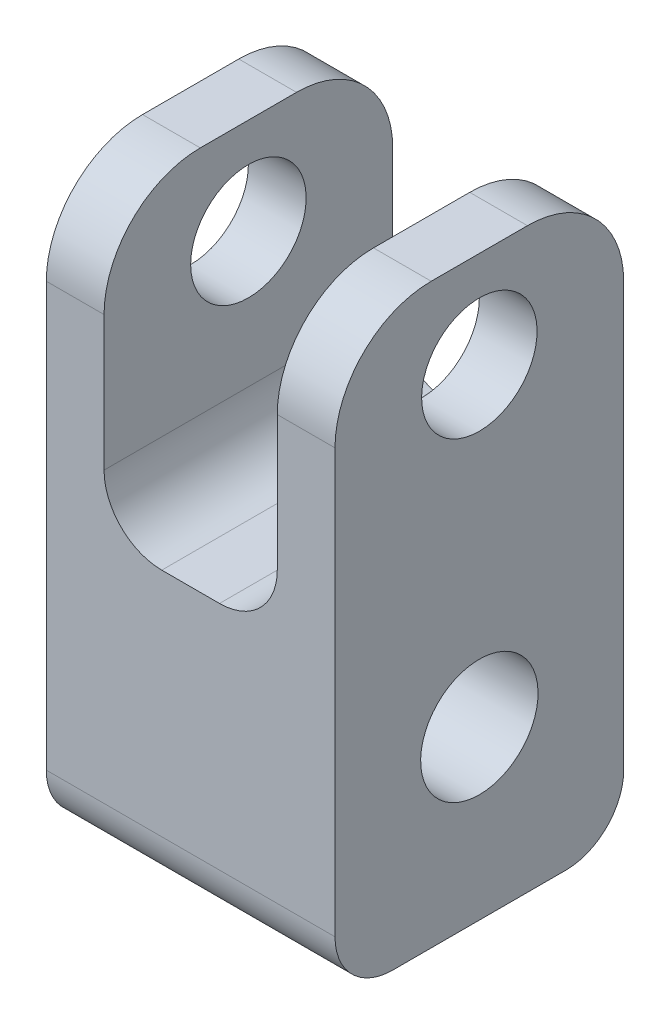
ISO-10303-21;
HEADER;
FILE_DESCRIPTION(('STEP AP214'),'2;1');
FILE_NAME('part.step','',(''),(''),'','','');
FILE_SCHEMA(('AUTOMOTIVE_DESIGN { 1 0 10303 214 1 1 1 1 }'));
ENDSEC;
DATA;
#1=APPLICATION_CONTEXT('core data for automotive mechanical design processes');
#2=APPLICATION_PROTOCOL_DEFINITION('international standard','automotive_design',2000,#1);
#3=PRODUCT_CONTEXT('',#1,'mechanical');
#4=PRODUCT('Part','Part','',(#3));
#5=PRODUCT_RELATED_PRODUCT_CATEGORY('part','',(#4));
#6=PRODUCT_DEFINITION_FORMATION('','',#4);
#7=PRODUCT_DEFINITION_CONTEXT('part definition',#1,'design');
#8=PRODUCT_DEFINITION('design','',#6,#7);
#9=PRODUCT_DEFINITION_SHAPE('','',#8);
#10=(LENGTH_UNIT() NAMED_UNIT(*) SI_UNIT(.MILLI.,.METRE.));
#11=(NAMED_UNIT(*) PLANE_ANGLE_UNIT() SI_UNIT($,.RADIAN.));
#12=(NAMED_UNIT(*) SI_UNIT($,.STERADIAN.) SOLID_ANGLE_UNIT());
#13=UNCERTAINTY_MEASURE_WITH_UNIT(LENGTH_MEASURE(1.E-05),#10,'distance_accuracy_value','');
#14=(GEOMETRIC_REPRESENTATION_CONTEXT(3) GLOBAL_UNCERTAINTY_ASSIGNED_CONTEXT((#13)) GLOBAL_UNIT_ASSIGNED_CONTEXT((#10,
#11,#12)) REPRESENTATION_CONTEXT('',''));
#15=CARTESIAN_POINT('',(0.,0.,0.));
#16=DIRECTION('',(0.,0.,1.));
#17=DIRECTION('',(1.,0.,0.));
#18=AXIS2_PLACEMENT_3D('',#15,#16,#17);
#19=CARTESIAN_POINT('',(-15.,15.,30.));
#20=DIRECTION('',(0.,-1.,0.));
#21=DIRECTION('',(0.,0.,-1.));
#22=AXIS2_PLACEMENT_3D('',#19,#20,#21);
#23=PLANE('',#22);
#24=DIRECTION('',(-1.,0.,0.));
#25=VECTOR('',#24,1.);
#26=CARTESIAN_POINT('',(-15.,15.,30.));
#27=LINE('',#26,#25);
#28=CARTESIAN_POINT('',(3.,15.,30.));
#29=VERTEX_POINT('',#28);
#30=CARTESIAN_POINT('',(-3.,15.,30.));
#31=VERTEX_POINT('',#30);
#32=EDGE_CURVE('E207',#29,#31,#27,.T.);
#33=ORIENTED_EDGE('',*,*,#32,.F.);
#34=DIRECTION('',(0.,0.,1.));
#35=VECTOR('',#34,1.);
#36=CARTESIAN_POINT('',(2.99999999999999,15.,0.));
#37=LINE('',#36,#35);
#38=CARTESIAN_POINT('',(2.99999999999999,15.,0.));
#39=VERTEX_POINT('',#38);
#40=EDGE_CURVE('E258',#29,#39,#37,.F.);
#41=ORIENTED_EDGE('',*,*,#40,.T.);
#42=DIRECTION('',(-1.,0.,0.));
#43=VECTOR('',#42,1.);
#44=CARTESIAN_POINT('',(-15.,15.,0.));
#45=LINE('',#44,#43);
#46=CARTESIAN_POINT('',(-3.,15.,0.));
#47=VERTEX_POINT('',#46);
#48=EDGE_CURVE('E215',#39,#47,#45,.T.);
#49=ORIENTED_EDGE('',*,*,#48,.T.);
#50=DIRECTION('',(0.,0.,-1.));
#51=VECTOR('',#50,1.);
#52=CARTESIAN_POINT('',(-3.,15.,30.));
#53=LINE('',#52,#51);
#54=EDGE_CURVE('E256',#47,#31,#53,.F.);
#55=ORIENTED_EDGE('',*,*,#54,.T.);
#56=EDGE_LOOP('',(#33,#41,#49,#55));
#57=FACE_BOUND('',#56,.T.);
#58=ADVANCED_FACE('F33',(#57),#23,.F.);
#59=CARTESIAN_POINT('',(15.,15.,30.));
#60=DIRECTION('',(-1.,0.,0.));
#61=DIRECTION('',(0.,-1.,0.));
#62=AXIS2_PLACEMENT_3D('',#59,#60,#61);
#63=PLANE('',#62);
#64=CARTESIAN_POINT('',(15.,2.38425902504744,15.));
#65=DIRECTION('',(-1.,0.,0.));
#66=DIRECTION('',(0.,-1.,0.));
#67=AXIS2_PLACEMENT_3D('',#64,#65,#66);
#68=CIRCLE('',#67,6.1);
#69=CARTESIAN_POINT('',(15.,-3.71574097495256,15.));
#70=VERTEX_POINT('',#69);
#71=EDGE_CURVE('E397',#70,#70,#68,.T.);
#72=ORIENTED_EDGE('',*,*,#71,.T.);
#73=EDGE_LOOP('',(#72));
#74=FACE_BOUND('',#73,.T.);
#75=CARTESIAN_POINT('',(15.,35.,15.));
#76=DIRECTION('',(-1.,0.,0.));
#77=DIRECTION('',(0.,-1.,0.));
#78=AXIS2_PLACEMENT_3D('',#75,#76,#77);
#79=CIRCLE('',#78,6.);
#80=CARTESIAN_POINT('',(15.,29.,15.));
#81=VERTEX_POINT('',#80);
#82=EDGE_CURVE('E253',#81,#81,#79,.T.);
#83=ORIENTED_EDGE('',*,*,#82,.T.);
#84=EDGE_LOOP('',(#83));
#85=FACE_BOUND('',#84,.T.);
#86=DIRECTION('',(0.,0.,-1.));
#87=VECTOR('',#86,1.);
#88=CARTESIAN_POINT('',(15.,-15.,30.));
#89=LINE('',#88,#87);
#90=CARTESIAN_POINT('',(15.,-15.,24.));
#91=VERTEX_POINT('',#90);
#92=CARTESIAN_POINT('',(15.,-15.,6.));
#93=VERTEX_POINT('',#92);
#94=EDGE_CURVE('E213',#91,#93,#89,.T.);
#95=ORIENTED_EDGE('',*,*,#94,.T.);
#96=CARTESIAN_POINT('',(15.,-9.,6.));
#97=DIRECTION('',(-1.,0.,0.));
#98=DIRECTION('',(0.,-1.,0.));
#99=AXIS2_PLACEMENT_3D('',#96,#97,#98);
#100=CIRCLE('',#99,6.);
#101=CARTESIAN_POINT('',(15.,-9.,0.));
#102=VERTEX_POINT('',#101);
#103=EDGE_CURVE('E278',#93,#102,#100,.F.);
#104=ORIENTED_EDGE('',*,*,#103,.T.);
#105=DIRECTION('',(0.,1.,0.));
#106=VECTOR('',#105,1.);
#107=CARTESIAN_POINT('',(15.,15.,0.));
#108=LINE('',#107,#106);
#109=CARTESIAN_POINT('',(15.,35.,0.));
#110=VERTEX_POINT('',#109);
#111=EDGE_CURVE('E204',#102,#110,#108,.T.);
#112=ORIENTED_EDGE('',*,*,#111,.T.);
#113=CARTESIAN_POINT('',(15.,35.,10.));
#114=DIRECTION('',(-1.,0.,0.));
#115=DIRECTION('',(0.,-1.,0.));
#116=AXIS2_PLACEMENT_3D('',#113,#114,#115);
#117=CIRCLE('',#116,10.);
#118=CARTESIAN_POINT('',(15.,45.,10.));
#119=VERTEX_POINT('',#118);
#120=EDGE_CURVE('E224',#110,#119,#117,.F.);
#121=ORIENTED_EDGE('',*,*,#120,.T.);
#122=DIRECTION('',(0.,0.,-1.));
#123=VECTOR('',#122,1.);
#124=CARTESIAN_POINT('',(15.,45.,30.));
#125=LINE('',#124,#123);
#126=CARTESIAN_POINT('',(15.,45.,20.));
#127=VERTEX_POINT('',#126);
#128=EDGE_CURVE('E172',#127,#119,#125,.T.);
#129=ORIENTED_EDGE('',*,*,#128,.F.);
#130=CARTESIAN_POINT('',(15.,35.,20.));
#131=DIRECTION('',(-1.,0.,0.));
#132=DIRECTION('',(0.,-1.,0.));
#133=AXIS2_PLACEMENT_3D('',#130,#131,#132);
#134=CIRCLE('',#133,10.);
#135=CARTESIAN_POINT('',(15.,35.,30.));
#136=VERTEX_POINT('',#135);
#137=EDGE_CURVE('E226',#127,#136,#134,.F.);
#138=ORIENTED_EDGE('',*,*,#137,.T.);
#139=DIRECTION('',(0.,1.,0.));
#140=VECTOR('',#139,1.);
#141=CARTESIAN_POINT('',(15.,15.,30.));
#142=LINE('',#141,#140);
#143=CARTESIAN_POINT('',(15.,-9.,30.));
#144=VERTEX_POINT('',#143);
#145=EDGE_CURVE('E205',#144,#136,#142,.T.);
#146=ORIENTED_EDGE('',*,*,#145,.F.);
#147=CARTESIAN_POINT('',(15.,-9.,24.));
#148=DIRECTION('',(-1.,0.,0.));
#149=DIRECTION('',(0.,-1.,0.));
#150=AXIS2_PLACEMENT_3D('',#147,#148,#149);
#151=CIRCLE('',#150,6.);
#152=EDGE_CURVE('E276',#144,#91,#151,.F.);
#153=ORIENTED_EDGE('',*,*,#152,.T.);
#154=EDGE_LOOP('',(#95,#104,#112,#121,#129,#138,#146,#153));
#155=FACE_BOUND('',#154,.T.);
#156=ADVANCED_FACE('F291',(#74,#85,#155),#63,.F.);
#157=CARTESIAN_POINT('',(-15.,15.,30.));
#158=DIRECTION('',(1.,0.,0.));
#159=DIRECTION('',(0.,1.,0.));
#160=AXIS2_PLACEMENT_3D('',#157,#158,#159);
#161=PLANE('',#160);
#162=CARTESIAN_POINT('',(-15.,2.38425902504744,15.));
#163=DIRECTION('',(-1.,0.,0.));
#164=DIRECTION('',(0.,-1.,0.));
#165=AXIS2_PLACEMENT_3D('',#162,#163,#164);
#166=CIRCLE('',#165,6.1);
#167=CARTESIAN_POINT('',(-15.,-3.71574097495257,15.));
#168=VERTEX_POINT('',#167);
#169=EDGE_CURVE('E393',#168,#168,#166,.T.);
#170=ORIENTED_EDGE('',*,*,#169,.F.);
#171=EDGE_LOOP('',(#170));
#172=FACE_BOUND('',#171,.T.);
#173=CARTESIAN_POINT('',(-15.,35.,15.));
#174=DIRECTION('',(-1.,0.,0.));
#175=DIRECTION('',(0.,-1.,0.));
#176=AXIS2_PLACEMENT_3D('',#173,#174,#175);
#177=CIRCLE('',#176,6.);
#178=CARTESIAN_POINT('',(-15.,29.,15.));
#179=VERTEX_POINT('',#178);
#180=EDGE_CURVE('E396',#179,#179,#177,.T.);
#181=ORIENTED_EDGE('',*,*,#180,.F.);
#182=EDGE_LOOP('',(#181));
#183=FACE_BOUND('',#182,.T.);
#184=DIRECTION('',(0.,-1.,0.));
#185=VECTOR('',#184,1.);
#186=CARTESIAN_POINT('',(-15.,15.,0.));
#187=LINE('',#186,#185);
#188=CARTESIAN_POINT('',(-15.,35.,0.));
#189=VERTEX_POINT('',#188);
#190=CARTESIAN_POINT('',(-15.,-9.,0.));
#191=VERTEX_POINT('',#190);
#192=EDGE_CURVE('E208',#189,#191,#187,.T.);
#193=ORIENTED_EDGE('',*,*,#192,.T.);
#194=CARTESIAN_POINT('',(-15.,-9.,6.));
#195=DIRECTION('',(1.,0.,0.));
#196=DIRECTION('',(0.,1.,0.));
#197=AXIS2_PLACEMENT_3D('',#194,#195,#196);
#198=CIRCLE('',#197,6.);
#199=CARTESIAN_POINT('',(-15.,-15.,6.));
#200=VERTEX_POINT('',#199);
#201=EDGE_CURVE('E41',#191,#200,#198,.F.);
#202=ORIENTED_EDGE('',*,*,#201,.T.);
#203=DIRECTION('',(0.,0.,-1.));
#204=VECTOR('',#203,1.);
#205=CARTESIAN_POINT('',(-15.,-15.,30.));
#206=LINE('',#205,#204);
#207=CARTESIAN_POINT('',(-15.,-15.,24.));
#208=VERTEX_POINT('',#207);
#209=EDGE_CURVE('E174',#208,#200,#206,.T.);
#210=ORIENTED_EDGE('',*,*,#209,.F.);
#211=CARTESIAN_POINT('',(-15.,-9.,24.));
#212=DIRECTION('',(1.,0.,0.));
#213=DIRECTION('',(0.,1.,0.));
#214=AXIS2_PLACEMENT_3D('',#211,#212,#213);
#215=CIRCLE('',#214,6.);
#216=CARTESIAN_POINT('',(-15.,-9.,30.));
#217=VERTEX_POINT('',#216);
#218=EDGE_CURVE('E48',#208,#217,#215,.F.);
#219=ORIENTED_EDGE('',*,*,#218,.T.);
#220=DIRECTION('',(0.,-1.,0.));
#221=VECTOR('',#220,1.);
#222=CARTESIAN_POINT('',(-15.,15.,30.));
#223=LINE('',#222,#221);
#224=CARTESIAN_POINT('',(-15.,35.,30.));
#225=VERTEX_POINT('',#224);
#226=EDGE_CURVE('E211',#225,#217,#223,.T.);
#227=ORIENTED_EDGE('',*,*,#226,.F.);
#228=CARTESIAN_POINT('',(-15.,35.,20.));
#229=DIRECTION('',(1.,0.,0.));
#230=DIRECTION('',(0.,1.,0.));
#231=AXIS2_PLACEMENT_3D('',#228,#229,#230);
#232=CIRCLE('',#231,10.);
#233=CARTESIAN_POINT('',(-15.,45.,20.));
#234=VERTEX_POINT('',#233);
#235=EDGE_CURVE('E242',#225,#234,#232,.F.);
#236=ORIENTED_EDGE('',*,*,#235,.T.);
#237=DIRECTION('',(0.,0.,1.));
#238=VECTOR('',#237,1.);
#239=CARTESIAN_POINT('',(-15.,45.,0.));
#240=LINE('',#239,#238);
#241=CARTESIAN_POINT('',(-15.,45.,10.));
#242=VERTEX_POINT('',#241);
#243=EDGE_CURVE('E192',#242,#234,#240,.T.);
#244=ORIENTED_EDGE('',*,*,#243,.F.);
#245=CARTESIAN_POINT('',(-15.,35.,10.));
#246=DIRECTION('',(1.,0.,0.));
#247=DIRECTION('',(0.,1.,0.));
#248=AXIS2_PLACEMENT_3D('',#245,#246,#247);
#249=CIRCLE('',#248,10.);
#250=EDGE_CURVE('E244',#242,#189,#249,.F.);
#251=ORIENTED_EDGE('',*,*,#250,.T.);
#252=EDGE_LOOP('',(#193,#202,#210,#219,#227,#236,#244,#251));
#253=FACE_BOUND('',#252,.T.);
#254=ADVANCED_FACE('F282',(#172,#183,#253),#161,.F.);
#255=CARTESIAN_POINT('',(-15.,-15.,30.));
#256=DIRECTION('',(0.,1.,0.));
#257=DIRECTION('',(0.,0.,1.));
#258=AXIS2_PLACEMENT_3D('',#255,#256,#257);
#259=PLANE('',#258);
#260=ORIENTED_EDGE('',*,*,#209,.T.);
#261=DIRECTION('',(1.,0.,0.));
#262=VECTOR('',#261,1.);
#263=CARTESIAN_POINT('',(-15.,-15.,6.));
#264=LINE('',#263,#262);
#265=EDGE_CURVE('E273',#200,#93,#264,.T.);
#266=ORIENTED_EDGE('',*,*,#265,.T.);
#267=ORIENTED_EDGE('',*,*,#94,.F.);
#268=DIRECTION('',(1.,0.,0.));
#269=VECTOR('',#268,1.);
#270=CARTESIAN_POINT('',(-15.,-15.,24.));
#271=LINE('',#270,#269);
#272=EDGE_CURVE('E271',#91,#208,#271,.F.);
#273=ORIENTED_EDGE('',*,*,#272,.T.);
#274=EDGE_LOOP('',(#260,#266,#267,#273));
#275=FACE_BOUND('',#274,.T.);
#276=ADVANCED_FACE('F286',(#275),#259,.F.);
#277=CARTESIAN_POINT('',(0.,0.,30.));
#278=DIRECTION('',(0.,0.,1.));
#279=DIRECTION('',(1.,0.,0.));
#280=AXIS2_PLACEMENT_3D('',#277,#278,#279);
#281=PLANE('',#280);
#282=ORIENTED_EDGE('',*,*,#226,.T.);
#283=DIRECTION('',(1.,0.,0.));
#284=VECTOR('',#283,1.);
#285=CARTESIAN_POINT('',(15.,-9.,30.));
#286=LINE('',#285,#284);
#287=EDGE_CURVE('E11',#217,#144,#286,.T.);
#288=ORIENTED_EDGE('',*,*,#287,.T.);
#289=ORIENTED_EDGE('',*,*,#145,.T.);
#290=DIRECTION('',(1.,0.,0.));
#291=VECTOR('',#290,1.);
#292=CARTESIAN_POINT('',(0.,35.,30.));
#293=LINE('',#292,#291);
#294=CARTESIAN_POINT('',(9.,35.,30.));
#295=VERTEX_POINT('',#294);
#296=EDGE_CURVE('E162',#136,#295,#293,.F.);
#297=ORIENTED_EDGE('',*,*,#296,.T.);
#298=DIRECTION('',(0.,-1.,0.));
#299=VECTOR('',#298,1.);
#300=CARTESIAN_POINT('',(9.,45.,30.));
#301=LINE('',#300,#299);
#302=CARTESIAN_POINT('',(9.,21.,30.));
#303=VERTEX_POINT('',#302);
#304=EDGE_CURVE('E189',#295,#303,#301,.T.);
#305=ORIENTED_EDGE('',*,*,#304,.T.);
#306=CARTESIAN_POINT('',(3.,21.,30.));
#307=DIRECTION('',(0.,0.,1.));
#308=DIRECTION('',(1.,0.,0.));
#309=AXIS2_PLACEMENT_3D('',#306,#307,#308);
#310=CIRCLE('',#309,6.);
#311=EDGE_CURVE('E263',#303,#29,#310,.F.);
#312=ORIENTED_EDGE('',*,*,#311,.T.);
#313=ORIENTED_EDGE('',*,*,#32,.T.);
#314=CARTESIAN_POINT('',(-3.,21.,30.));
#315=DIRECTION('',(0.,0.,1.));
#316=DIRECTION('',(1.,0.,0.));
#317=AXIS2_PLACEMENT_3D('',#314,#315,#316);
#318=CIRCLE('',#317,6.);
#319=CARTESIAN_POINT('',(-9.00000000000001,21.,30.));
#320=VERTEX_POINT('',#319);
#321=EDGE_CURVE('E269',#31,#320,#318,.F.);
#322=ORIENTED_EDGE('',*,*,#321,.T.);
#323=DIRECTION('',(0.,-1.,0.));
#324=VECTOR('',#323,1.);
#325=CARTESIAN_POINT('',(-9.00000000000001,45.,30.));
#326=LINE('',#325,#324);
#327=CARTESIAN_POINT('',(-9.00000000000001,35.,30.));
#328=VERTEX_POINT('',#327);
#329=EDGE_CURVE('E201',#328,#320,#326,.T.);
#330=ORIENTED_EDGE('',*,*,#329,.F.);
#331=DIRECTION('',(1.,0.,0.));
#332=VECTOR('',#331,1.);
#333=CARTESIAN_POINT('',(0.,35.,30.));
#334=LINE('',#333,#332);
#335=EDGE_CURVE('E229',#328,#225,#334,.F.);
#336=ORIENTED_EDGE('',*,*,#335,.T.);
#337=EDGE_LOOP('',(#282,#288,#289,#297,#305,#312,#313,#322,#330,#336));
#338=FACE_BOUND('',#337,.T.);
#339=ADVANCED_FACE('F298',(#338),#281,.T.);
#340=CARTESIAN_POINT('',(0.,0.,0.));
#341=DIRECTION('',(0.,0.,1.));
#342=DIRECTION('',(1.,0.,0.));
#343=AXIS2_PLACEMENT_3D('',#340,#341,#342);
#344=PLANE('',#343);
#345=ORIENTED_EDGE('',*,*,#111,.F.);
#346=DIRECTION('',(1.,0.,0.));
#347=VECTOR('',#346,1.);
#348=CARTESIAN_POINT('',(0.,-9.,0.));
#349=LINE('',#348,#347);
#350=EDGE_CURVE('E56',#102,#191,#349,.F.);
#351=ORIENTED_EDGE('',*,*,#350,.T.);
#352=ORIENTED_EDGE('',*,*,#192,.F.);
#353=DIRECTION('',(-1.,0.,0.));
#354=VECTOR('',#353,1.);
#355=CARTESIAN_POINT('',(-9.00000000000001,35.,0.));
#356=LINE('',#355,#354);
#357=CARTESIAN_POINT('',(-9.00000000000001,35.,0.));
#358=VERTEX_POINT('',#357);
#359=EDGE_CURVE('E233',#189,#358,#356,.F.);
#360=ORIENTED_EDGE('',*,*,#359,.T.);
#361=DIRECTION('',(0.,-1.,0.));
#362=VECTOR('',#361,1.);
#363=CARTESIAN_POINT('',(-9.00000000000001,45.,0.));
#364=LINE('',#363,#362);
#365=CARTESIAN_POINT('',(-9.00000000000001,21.,0.));
#366=VERTEX_POINT('',#365);
#367=EDGE_CURVE('E198',#358,#366,#364,.T.);
#368=ORIENTED_EDGE('',*,*,#367,.T.);
#369=CARTESIAN_POINT('',(-3.,21.,0.));
#370=DIRECTION('',(0.,0.,1.));
#371=DIRECTION('',(1.,0.,0.));
#372=AXIS2_PLACEMENT_3D('',#369,#370,#371);
#373=CIRCLE('',#372,6.);
#374=EDGE_CURVE('E267',#366,#47,#373,.T.);
#375=ORIENTED_EDGE('',*,*,#374,.T.);
#376=ORIENTED_EDGE('',*,*,#48,.F.);
#377=CARTESIAN_POINT('',(2.99999999999999,21.,0.));
#378=DIRECTION('',(0.,0.,1.));
#379=DIRECTION('',(1.,0.,0.));
#380=AXIS2_PLACEMENT_3D('',#377,#378,#379);
#381=CIRCLE('',#380,6.);
#382=CARTESIAN_POINT('',(8.99999999999999,21.,0.));
#383=VERTEX_POINT('',#382);
#384=EDGE_CURVE('E265',#39,#383,#381,.T.);
#385=ORIENTED_EDGE('',*,*,#384,.T.);
#386=DIRECTION('',(0.,-1.,0.));
#387=VECTOR('',#386,1.);
#388=CARTESIAN_POINT('',(8.99999999999999,45.,0.));
#389=LINE('',#388,#387);
#390=CARTESIAN_POINT('',(8.99999999999999,35.,0.));
#391=VERTEX_POINT('',#390);
#392=EDGE_CURVE('E181',#391,#383,#389,.T.);
#393=ORIENTED_EDGE('',*,*,#392,.F.);
#394=DIRECTION('',(-1.,0.,0.));
#395=VECTOR('',#394,1.);
#396=CARTESIAN_POINT('',(15.,35.,0.));
#397=LINE('',#396,#395);
#398=EDGE_CURVE('E156',#391,#110,#397,.F.);
#399=ORIENTED_EDGE('',*,*,#398,.T.);
#400=EDGE_LOOP('',(#345,#351,#352,#360,#368,#375,#376,#385,#393,#399));
#401=FACE_BOUND('',#400,.T.);
#402=ADVANCED_FACE('F292',(#401),#344,.F.);
#403=CARTESIAN_POINT('',(-9.00000000000001,45.,30.));
#404=DIRECTION('',(-1.,0.,0.));
#405=DIRECTION('',(0.,0.,1.));
#406=AXIS2_PLACEMENT_3D('',#403,#404,#405);
#407=PLANE('',#406);
#408=CARTESIAN_POINT('',(-9.00000000000001,35.,15.));
#409=DIRECTION('',(-1.,0.,0.));
#410=DIRECTION('',(0.,0.,1.));
#411=AXIS2_PLACEMENT_3D('',#408,#409,#410);
#412=CIRCLE('',#411,6.);
#413=CARTESIAN_POINT('',(-9.00000000000001,35.,21.));
#414=VERTEX_POINT('',#413);
#415=EDGE_CURVE('E179',#414,#414,#412,.T.);
#416=ORIENTED_EDGE('',*,*,#415,.T.);
#417=EDGE_LOOP('',(#416));
#418=FACE_BOUND('',#417,.T.);
#419=ORIENTED_EDGE('',*,*,#329,.T.);
#420=DIRECTION('',(0.,0.,-1.));
#421=VECTOR('',#420,1.);
#422=CARTESIAN_POINT('',(-9.00000000000001,21.,0.));
#423=LINE('',#422,#421);
#424=EDGE_CURVE('E260',#320,#366,#423,.T.);
#425=ORIENTED_EDGE('',*,*,#424,.T.);
#426=ORIENTED_EDGE('',*,*,#367,.F.);
#427=CARTESIAN_POINT('',(-9.00000000000001,35.,10.));
#428=DIRECTION('',(-1.,0.,0.));
#429=DIRECTION('',(0.,0.,1.));
#430=AXIS2_PLACEMENT_3D('',#427,#428,#429);
#431=CIRCLE('',#430,10.);
#432=CARTESIAN_POINT('',(-9.00000000000001,45.,10.));
#433=VERTEX_POINT('',#432);
#434=EDGE_CURVE('E248',#358,#433,#431,.F.);
#435=ORIENTED_EDGE('',*,*,#434,.T.);
#436=DIRECTION('',(0.,0.,-1.));
#437=VECTOR('',#436,1.);
#438=CARTESIAN_POINT('',(-9.00000000000001,45.,30.));
#439=LINE('',#438,#437);
#440=CARTESIAN_POINT('',(-9.00000000000001,45.,20.));
#441=VERTEX_POINT('',#440);
#442=EDGE_CURVE('E195',#441,#433,#439,.T.);
#443=ORIENTED_EDGE('',*,*,#442,.F.);
#444=CARTESIAN_POINT('',(-9.00000000000001,35.,20.));
#445=DIRECTION('',(-1.,0.,0.));
#446=DIRECTION('',(0.,0.,1.));
#447=AXIS2_PLACEMENT_3D('',#444,#445,#446);
#448=CIRCLE('',#447,10.);
#449=EDGE_CURVE('E246',#441,#328,#448,.F.);
#450=ORIENTED_EDGE('',*,*,#449,.T.);
#451=EDGE_LOOP('',(#419,#425,#426,#435,#443,#450));
#452=FACE_BOUND('',#451,.T.);
#453=ADVANCED_FACE('F315',(#418,#452),#407,.F.);
#454=CARTESIAN_POINT('',(0.,45.,0.));
#455=DIRECTION('',(0.,1.,0.));
#456=DIRECTION('',(0.,0.,1.));
#457=AXIS2_PLACEMENT_3D('',#454,#455,#456);
#458=PLANE('',#457);
#459=ORIENTED_EDGE('',*,*,#442,.T.);
#460=DIRECTION('',(-1.,0.,0.));
#461=VECTOR('',#460,1.);
#462=CARTESIAN_POINT('',(-15.,45.,10.));
#463=LINE('',#462,#461);
#464=EDGE_CURVE('E239',#433,#242,#463,.T.);
#465=ORIENTED_EDGE('',*,*,#464,.T.);
#466=ORIENTED_EDGE('',*,*,#243,.T.);
#467=DIRECTION('',(1.,0.,0.));
#468=VECTOR('',#467,1.);
#469=CARTESIAN_POINT('',(0.,45.,20.));
#470=LINE('',#469,#468);
#471=EDGE_CURVE('E236',#234,#441,#470,.T.);
#472=ORIENTED_EDGE('',*,*,#471,.T.);
#473=EDGE_LOOP('',(#459,#465,#466,#472));
#474=FACE_BOUND('',#473,.T.);
#475=ADVANCED_FACE('F323',(#474),#458,.T.);
#476=CARTESIAN_POINT('',(8.99999999999999,45.,0.));
#477=DIRECTION('',(1.,0.,0.));
#478=DIRECTION('',(0.,0.,-1.));
#479=AXIS2_PLACEMENT_3D('',#476,#477,#478);
#480=PLANE('',#479);
#481=CARTESIAN_POINT('',(9.,35.,15.));
#482=DIRECTION('',(1.,0.,0.));
#483=DIRECTION('',(0.,0.,-1.));
#484=AXIS2_PLACEMENT_3D('',#481,#482,#483);
#485=CIRCLE('',#484,6.);
#486=CARTESIAN_POINT('',(9.,35.,9.));
#487=VERTEX_POINT('',#486);
#488=EDGE_CURVE('E184',#487,#487,#485,.T.);
#489=ORIENTED_EDGE('',*,*,#488,.T.);
#490=EDGE_LOOP('',(#489));
#491=FACE_BOUND('',#490,.T.);
#492=ORIENTED_EDGE('',*,*,#392,.T.);
#493=DIRECTION('',(0.,0.,1.));
#494=VECTOR('',#493,1.);
#495=CARTESIAN_POINT('',(9.,21.,30.));
#496=LINE('',#495,#494);
#497=EDGE_CURVE('E250',#383,#303,#496,.T.);
#498=ORIENTED_EDGE('',*,*,#497,.T.);
#499=ORIENTED_EDGE('',*,*,#304,.F.);
#500=CARTESIAN_POINT('',(9.,35.,20.));
#501=DIRECTION('',(1.,0.,0.));
#502=DIRECTION('',(0.,0.,-1.));
#503=AXIS2_PLACEMENT_3D('',#500,#501,#502);
#504=CIRCLE('',#503,10.);
#505=CARTESIAN_POINT('',(9.,45.,20.));
#506=VERTEX_POINT('',#505);
#507=EDGE_CURVE('E161',#295,#506,#504,.F.);
#508=ORIENTED_EDGE('',*,*,#507,.T.);
#509=DIRECTION('',(0.,0.,1.));
#510=VECTOR('',#509,1.);
#511=CARTESIAN_POINT('',(8.99999999999999,45.,0.));
#512=LINE('',#511,#510);
#513=CARTESIAN_POINT('',(9.,45.,10.));
#514=VERTEX_POINT('',#513);
#515=EDGE_CURVE('E169',#514,#506,#512,.T.);
#516=ORIENTED_EDGE('',*,*,#515,.F.);
#517=CARTESIAN_POINT('',(9.,35.,10.));
#518=DIRECTION('',(1.,0.,0.));
#519=DIRECTION('',(0.,0.,-1.));
#520=AXIS2_PLACEMENT_3D('',#517,#518,#519);
#521=CIRCLE('',#520,10.);
#522=EDGE_CURVE('E150',#514,#391,#521,.F.);
#523=ORIENTED_EDGE('',*,*,#522,.T.);
#524=EDGE_LOOP('',(#492,#498,#499,#508,#516,#523));
#525=FACE_BOUND('',#524,.T.);
#526=ADVANCED_FACE('F176',(#491,#525),#480,.F.);
#527=CARTESIAN_POINT('',(0.,45.,0.));
#528=DIRECTION('',(0.,1.,0.));
#529=DIRECTION('',(0.,0.,1.));
#530=AXIS2_PLACEMENT_3D('',#527,#528,#529);
#531=PLANE('',#530);
#532=ORIENTED_EDGE('',*,*,#515,.T.);
#533=DIRECTION('',(1.,0.,0.));
#534=VECTOR('',#533,1.);
#535=CARTESIAN_POINT('',(0.,45.,20.));
#536=LINE('',#535,#534);
#537=EDGE_CURVE('E173',#506,#127,#536,.T.);
#538=ORIENTED_EDGE('',*,*,#537,.T.);
#539=ORIENTED_EDGE('',*,*,#128,.T.);
#540=DIRECTION('',(-1.,0.,0.));
#541=VECTOR('',#540,1.);
#542=CARTESIAN_POINT('',(8.99999999999999,45.,10.));
#543=LINE('',#542,#541);
#544=EDGE_CURVE('E154',#119,#514,#543,.T.);
#545=ORIENTED_EDGE('',*,*,#544,.T.);
#546=EDGE_LOOP('',(#532,#538,#539,#545));
#547=FACE_BOUND('',#546,.T.);
#548=ADVANCED_FACE('F167',(#547),#531,.T.);
#549=CARTESIAN_POINT('',(0.,35.,20.));
#550=DIRECTION('',(1.,0.,0.));
#551=DIRECTION('',(0.,0.,-1.));
#552=AXIS2_PLACEMENT_3D('',#549,#550,#551);
#553=CYLINDRICAL_SURFACE('',#552,10.);
#554=ORIENTED_EDGE('',*,*,#507,.F.);
#555=ORIENTED_EDGE('',*,*,#296,.F.);
#556=ORIENTED_EDGE('',*,*,#137,.F.);
#557=ORIENTED_EDGE('',*,*,#537,.F.);
#558=EDGE_LOOP('',(#554,#555,#556,#557));
#559=FACE_BOUND('',#558,.T.);
#560=ADVANCED_FACE('F296',(#559),#553,.T.);
#561=CARTESIAN_POINT('',(0.,35.,10.));
#562=DIRECTION('',(1.,0.,0.));
#563=DIRECTION('',(0.,0.,-1.));
#564=AXIS2_PLACEMENT_3D('',#561,#562,#563);
#565=CYLINDRICAL_SURFACE('',#564,10.);
#566=ORIENTED_EDGE('',*,*,#120,.F.);
#567=ORIENTED_EDGE('',*,*,#398,.F.);
#568=ORIENTED_EDGE('',*,*,#522,.F.);
#569=ORIENTED_EDGE('',*,*,#544,.F.);
#570=EDGE_LOOP('',(#566,#567,#568,#569));
#571=FACE_BOUND('',#570,.T.);
#572=ADVANCED_FACE('F153',(#571),#565,.T.);
#573=CARTESIAN_POINT('',(0.,35.,10.));
#574=DIRECTION('',(1.,0.,0.));
#575=DIRECTION('',(0.,0.,-1.));
#576=AXIS2_PLACEMENT_3D('',#573,#574,#575);
#577=CYLINDRICAL_SURFACE('',#576,10.);
#578=ORIENTED_EDGE('',*,*,#434,.F.);
#579=ORIENTED_EDGE('',*,*,#359,.F.);
#580=ORIENTED_EDGE('',*,*,#250,.F.);
#581=ORIENTED_EDGE('',*,*,#464,.F.);
#582=EDGE_LOOP('',(#578,#579,#580,#581));
#583=FACE_BOUND('',#582,.T.);
#584=ADVANCED_FACE('F347',(#583),#577,.T.);
#585=CARTESIAN_POINT('',(0.,35.,20.));
#586=DIRECTION('',(1.,0.,0.));
#587=DIRECTION('',(0.,0.,-1.));
#588=AXIS2_PLACEMENT_3D('',#585,#586,#587);
#589=CYLINDRICAL_SURFACE('',#588,10.);
#590=ORIENTED_EDGE('',*,*,#235,.F.);
#591=ORIENTED_EDGE('',*,*,#335,.F.);
#592=ORIENTED_EDGE('',*,*,#449,.F.);
#593=ORIENTED_EDGE('',*,*,#471,.F.);
#594=EDGE_LOOP('',(#590,#591,#592,#593));
#595=FACE_BOUND('',#594,.T.);
#596=ADVANCED_FACE('F321',(#595),#589,.T.);
#597=CARTESIAN_POINT('',(15.,35.,15.));
#598=DIRECTION('',(-1.,0.,0.));
#599=DIRECTION('',(0.,-1.,0.));
#600=AXIS2_PLACEMENT_3D('',#597,#598,#599);
#601=CYLINDRICAL_SURFACE('',#600,6.);
#602=ORIENTED_EDGE('',*,*,#82,.F.);
#603=EDGE_LOOP('',(#602));
#604=FACE_BOUND('',#603,.T.);
#605=ORIENTED_EDGE('',*,*,#488,.F.);
#606=EDGE_LOOP('',(#605));
#607=FACE_BOUND('',#606,.T.);
#608=ADVANCED_FACE('F353',(#604,#607),#601,.F.);
#609=ORIENTED_EDGE('',*,*,#180,.T.);
#610=EDGE_LOOP('',(#609));
#611=FACE_BOUND('',#610,.T.);
#612=ORIENTED_EDGE('',*,*,#415,.F.);
#613=EDGE_LOOP('',(#612));
#614=FACE_BOUND('',#613,.T.);
#615=ADVANCED_FACE('F356',(#611,#614),#601,.F.);
#616=CARTESIAN_POINT('',(2.99999999999999,21.,0.));
#617=DIRECTION('',(0.,0.,-1.));
#618=DIRECTION('',(-1.,0.,0.));
#619=AXIS2_PLACEMENT_3D('',#616,#617,#618);
#620=CYLINDRICAL_SURFACE('',#619,6.);
#621=ORIENTED_EDGE('',*,*,#384,.F.);
#622=ORIENTED_EDGE('',*,*,#40,.F.);
#623=ORIENTED_EDGE('',*,*,#311,.F.);
#624=ORIENTED_EDGE('',*,*,#497,.F.);
#625=EDGE_LOOP('',(#621,#622,#623,#624));
#626=FACE_BOUND('',#625,.T.);
#627=ADVANCED_FACE('F302',(#626),#620,.F.);
#628=CARTESIAN_POINT('',(-3.,21.,30.));
#629=DIRECTION('',(0.,0.,1.));
#630=DIRECTION('',(1.,0.,0.));
#631=AXIS2_PLACEMENT_3D('',#628,#629,#630);
#632=CYLINDRICAL_SURFACE('',#631,6.);
#633=ORIENTED_EDGE('',*,*,#321,.F.);
#634=ORIENTED_EDGE('',*,*,#54,.F.);
#635=ORIENTED_EDGE('',*,*,#374,.F.);
#636=ORIENTED_EDGE('',*,*,#424,.F.);
#637=EDGE_LOOP('',(#633,#634,#635,#636));
#638=FACE_BOUND('',#637,.T.);
#639=ADVANCED_FACE('F310',(#638),#632,.F.);
#640=CARTESIAN_POINT('',(47.,2.38425902504744,15.));
#641=DIRECTION('',(-1.,0.,0.));
#642=DIRECTION('',(0.,-1.,0.));
#643=AXIS2_PLACEMENT_3D('',#640,#641,#642);
#644=CYLINDRICAL_SURFACE('',#643,6.1);
#645=ORIENTED_EDGE('',*,*,#169,.T.);
#646=EDGE_LOOP('',(#645));
#647=FACE_BOUND('',#646,.T.);
#648=ORIENTED_EDGE('',*,*,#71,.F.);
#649=EDGE_LOOP('',(#648));
#650=FACE_BOUND('',#649,.T.);
#651=ADVANCED_FACE('F332',(#647,#650),#644,.F.);
#652=CARTESIAN_POINT('',(-15.,-9.,6.));
#653=DIRECTION('',(1.,0.,0.));
#654=DIRECTION('',(0.,0.,-1.));
#655=AXIS2_PLACEMENT_3D('',#652,#653,#654);
#656=CYLINDRICAL_SURFACE('',#655,6.);
#657=ORIENTED_EDGE('',*,*,#201,.F.);
#658=ORIENTED_EDGE('',*,*,#350,.F.);
#659=ORIENTED_EDGE('',*,*,#103,.F.);
#660=ORIENTED_EDGE('',*,*,#265,.F.);
#661=EDGE_LOOP('',(#657,#658,#659,#660));
#662=FACE_BOUND('',#661,.T.);
#663=ADVANCED_FACE('F289',(#662),#656,.T.);
#664=CARTESIAN_POINT('',(0.,-9.,24.));
#665=DIRECTION('',(-1.,0.,0.));
#666=DIRECTION('',(0.,0.,1.));
#667=AXIS2_PLACEMENT_3D('',#664,#665,#666);
#668=CYLINDRICAL_SURFACE('',#667,6.);
#669=ORIENTED_EDGE('',*,*,#218,.F.);
#670=ORIENTED_EDGE('',*,*,#272,.F.);
#671=ORIENTED_EDGE('',*,*,#152,.F.);
#672=ORIENTED_EDGE('',*,*,#287,.F.);
#673=EDGE_LOOP('',(#669,#670,#671,#672));
#674=FACE_BOUND('',#673,.T.);
#675=ADVANCED_FACE('F35',(#674),#668,.T.);
#676=CLOSED_SHELL('',(#58,#156,#254,#276,#339,#402,#453,#475,#526,#548,#560,#572,#584,#596,#608,
#615,#627,#639,#651,#663,#675));
#677=MANIFOLD_SOLID_BREP('B2',#676);
#678=ADVANCED_BREP_SHAPE_REPRESENTATION('',(#18,#677),#14);
#679=SHAPE_DEFINITION_REPRESENTATION(#9,#678);
ENDSEC;
END-ISO-10303-21;
